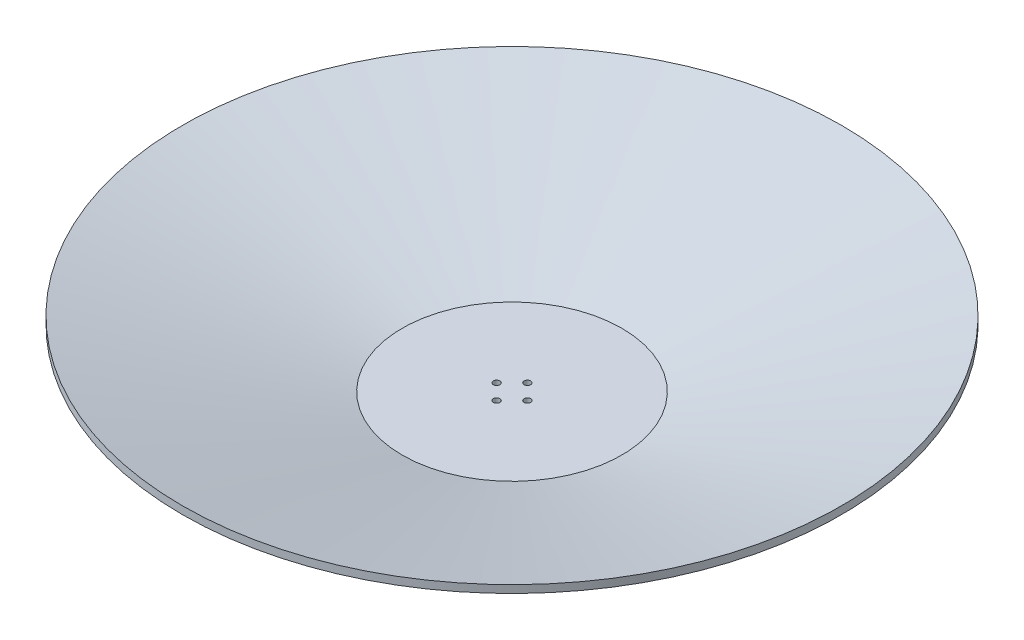
ISO-10303-21;
HEADER;
FILE_DESCRIPTION(('STEP AP214'),'2;1');
FILE_NAME('part.step','',(''),(''),'','','');
FILE_SCHEMA(('AUTOMOTIVE_DESIGN { 1 0 10303 214 1 1 1 1 }'));
ENDSEC;
DATA;
#1=APPLICATION_CONTEXT('core data for automotive mechanical design processes');
#2=APPLICATION_PROTOCOL_DEFINITION('international standard','automotive_design',2000,#1);
#3=PRODUCT_CONTEXT('',#1,'mechanical');
#4=PRODUCT('Part','Part','',(#3));
#5=PRODUCT_RELATED_PRODUCT_CATEGORY('part','',(#4));
#6=PRODUCT_DEFINITION_FORMATION('','',#4);
#7=PRODUCT_DEFINITION_CONTEXT('part definition',#1,'design');
#8=PRODUCT_DEFINITION('design','',#6,#7);
#9=PRODUCT_DEFINITION_SHAPE('','',#8);
#10=(LENGTH_UNIT() NAMED_UNIT(*) SI_UNIT(.MILLI.,.METRE.));
#11=(NAMED_UNIT(*) PLANE_ANGLE_UNIT() SI_UNIT($,.RADIAN.));
#12=(NAMED_UNIT(*) SI_UNIT($,.STERADIAN.) SOLID_ANGLE_UNIT());
#13=UNCERTAINTY_MEASURE_WITH_UNIT(LENGTH_MEASURE(1.E-05),#10,'distance_accuracy_value','');
#14=(GEOMETRIC_REPRESENTATION_CONTEXT(3) GLOBAL_UNCERTAINTY_ASSIGNED_CONTEXT((#13)) GLOBAL_UNIT_ASSIGNED_CONTEXT((#10,
#11,#12)) REPRESENTATION_CONTEXT('',''));
#15=CARTESIAN_POINT('',(0.,0.,0.));
#16=DIRECTION('',(0.,0.,1.));
#17=DIRECTION('',(1.,0.,0.));
#18=AXIS2_PLACEMENT_3D('',#15,#16,#17);
#19=CARTESIAN_POINT('',(0.,-15.,0.));
#20=DIRECTION('',(0.,-1.,0.));
#21=DIRECTION('',(0.,0.,-1.));
#22=AXIS2_PLACEMENT_3D('',#19,#20,#21);
#23=PLANE('',#22);
#24=DIRECTION('',(1.,0.,0.));
#25=VECTOR('',#24,1.);
#26=CARTESIAN_POINT('',(-29.,-15.,13.));
#27=LINE('',#26,#25);
#28=CARTESIAN_POINT('',(-29.,-15.,13.));
#29=VERTEX_POINT('',#28);
#30=CARTESIAN_POINT('',(-27.0370116691915,-15.,13.));
#31=VERTEX_POINT('',#30);
#32=EDGE_CURVE('E148',#29,#31,#27,.T.);
#33=ORIENTED_EDGE('',*,*,#32,.T.);
#34=CARTESIAN_POINT('',(0.,-15.,0.));
#35=DIRECTION('',(0.,-1.,0.));
#36=DIRECTION('',(0.,0.,-1.));
#37=AXIS2_PLACEMENT_3D('',#34,#35,#36);
#38=CIRCLE('',#37,30.);
#39=CARTESIAN_POINT('',(27.0370116691915,-15.,13.));
#40=VERTEX_POINT('',#39);
#41=EDGE_CURVE('E165',#40,#31,#38,.T.);
#42=ORIENTED_EDGE('',*,*,#41,.F.);
#43=CARTESIAN_POINT('',(29.,-15.,13.));
#44=VERTEX_POINT('',#43);
#45=EDGE_CURVE('E154',#40,#44,#27,.T.);
#46=ORIENTED_EDGE('',*,*,#45,.T.);
#47=DIRECTION('',(0.,0.,1.));
#48=VECTOR('',#47,1.);
#49=CARTESIAN_POINT('',(29.,-15.,-13.));
#50=LINE('',#49,#48);
#51=CARTESIAN_POINT('',(29.,-15.,7.68114574786857));
#52=VERTEX_POINT('',#51);
#53=EDGE_CURVE('E136',#52,#44,#50,.T.);
#54=ORIENTED_EDGE('',*,*,#53,.F.);
#55=CARTESIAN_POINT('',(29.,-15.,-7.68114574786857));
#56=VERTEX_POINT('',#55);
#57=EDGE_CURVE('E207',#56,#52,#38,.T.);
#58=ORIENTED_EDGE('',*,*,#57,.F.);
#59=CARTESIAN_POINT('',(29.,-15.,-13.));
#60=VERTEX_POINT('',#59);
#61=EDGE_CURVE('E147',#60,#56,#50,.T.);
#62=ORIENTED_EDGE('',*,*,#61,.F.);
#63=DIRECTION('',(1.,0.,0.));
#64=VECTOR('',#63,1.);
#65=CARTESIAN_POINT('',(-29.,-15.,-13.));
#66=LINE('',#65,#64);
#67=CARTESIAN_POINT('',(27.0370116691915,-15.,-13.));
#68=VERTEX_POINT('',#67);
#69=EDGE_CURVE('E174',#68,#60,#66,.T.);
#70=ORIENTED_EDGE('',*,*,#69,.F.);
#71=CARTESIAN_POINT('',(-27.0370116691915,-15.,-13.));
#72=VERTEX_POINT('',#71);
#73=EDGE_CURVE('E196',#72,#68,#38,.T.);
#74=ORIENTED_EDGE('',*,*,#73,.F.);
#75=CARTESIAN_POINT('',(-29.,-15.,-13.));
#76=VERTEX_POINT('',#75);
#77=EDGE_CURVE('E175',#76,#72,#66,.T.);
#78=ORIENTED_EDGE('',*,*,#77,.F.);
#79=DIRECTION('',(0.,0.,1.));
#80=VECTOR('',#79,1.);
#81=CARTESIAN_POINT('',(-29.,-15.,-13.));
#82=LINE('',#81,#80);
#83=CARTESIAN_POINT('',(-29.,-15.,-7.68114574786865));
#84=VERTEX_POINT('',#83);
#85=EDGE_CURVE('E159',#76,#84,#82,.T.);
#86=ORIENTED_EDGE('',*,*,#85,.T.);
#87=CARTESIAN_POINT('',(-29.,-15.,7.68114574786865));
#88=VERTEX_POINT('',#87);
#89=EDGE_CURVE('E212',#88,#84,#38,.T.);
#90=ORIENTED_EDGE('',*,*,#89,.F.);
#91=EDGE_CURVE('E178',#88,#29,#82,.T.);
#92=ORIENTED_EDGE('',*,*,#91,.T.);
#93=EDGE_LOOP('',(#33,#42,#46,#54,#58,#62,#70,#74,#78,#86,#90,#92));
#94=FACE_BOUND('',#93,.T.);
#95=CARTESIAN_POINT('',(0.,-15.,0.));
#96=DIRECTION('',(0.,-1.,0.));
#97=DIRECTION('',(0.,0.,-1.));
#98=AXIS2_PLACEMENT_3D('',#95,#96,#97);
#99=CIRCLE('',#98,35.);
#100=CARTESIAN_POINT('',(0.,-15.,-35.));
#101=VERTEX_POINT('',#100);
#102=EDGE_CURVE('E244',#101,#101,#99,.T.);
#103=ORIENTED_EDGE('',*,*,#102,.T.);
#104=EDGE_LOOP('',(#103));
#105=FACE_BOUND('',#104,.T.);
#106=ADVANCED_FACE('F45',(#94,#105),#23,.T.);
#107=CARTESIAN_POINT('',(0.,0.,0.));
#108=DIRECTION('',(0.,-1.,0.));
#109=DIRECTION('',(0.,0.,-1.));
#110=AXIS2_PLACEMENT_3D('',#107,#108,#109);
#111=CYLINDRICAL_SURFACE('',#110,30.);
#112=ORIENTED_EDGE('',*,*,#41,.T.);
#113=DIRECTION('',(0.,-1.,0.));
#114=VECTOR('',#113,1.);
#115=CARTESIAN_POINT('',(-27.0370116691915,0.,13.));
#116=LINE('',#115,#114);
#117=CARTESIAN_POINT('',(-27.0370116691915,0.,13.));
#118=VERTEX_POINT('',#117);
#119=EDGE_CURVE('E12',#31,#118,#116,.F.);
#120=ORIENTED_EDGE('',*,*,#119,.T.);
#121=CARTESIAN_POINT('',(0.,0.,0.));
#122=DIRECTION('',(0.,-1.,0.));
#123=DIRECTION('',(0.,0.,-1.));
#124=AXIS2_PLACEMENT_3D('',#121,#122,#123);
#125=CIRCLE('',#124,30.);
#126=CARTESIAN_POINT('',(27.0370116691915,0.,13.));
#127=VERTEX_POINT('',#126);
#128=EDGE_CURVE('E289',#127,#118,#125,.T.);
#129=ORIENTED_EDGE('',*,*,#128,.F.);
#130=DIRECTION('',(0.,-1.,0.));
#131=VECTOR('',#130,1.);
#132=CARTESIAN_POINT('',(27.0370116691915,0.,13.));
#133=LINE('',#132,#131);
#134=EDGE_CURVE('E53',#127,#40,#133,.T.);
#135=ORIENTED_EDGE('',*,*,#134,.T.);
#136=EDGE_LOOP('',(#112,#120,#129,#135));
#137=FACE_BOUND('',#136,.T.);
#138=ADVANCED_FACE('F287',(#137),#111,.F.);
#139=DIRECTION('',(0.,-1.,0.));
#140=VECTOR('',#139,1.);
#141=CARTESIAN_POINT('',(-27.0370116691915,0.,-13.));
#142=LINE('',#141,#140);
#143=CARTESIAN_POINT('',(-27.0370116691915,0.,-13.));
#144=VERTEX_POINT('',#143);
#145=EDGE_CURVE('E274',#72,#144,#142,.F.);
#146=ORIENTED_EDGE('',*,*,#145,.F.);
#147=ORIENTED_EDGE('',*,*,#73,.T.);
#148=DIRECTION('',(0.,-1.,0.));
#149=VECTOR('',#148,1.);
#150=CARTESIAN_POINT('',(27.0370116691915,0.,-13.));
#151=LINE('',#150,#149);
#152=CARTESIAN_POINT('',(27.0370116691915,0.,-13.));
#153=VERTEX_POINT('',#152);
#154=EDGE_CURVE('E271',#153,#68,#151,.T.);
#155=ORIENTED_EDGE('',*,*,#154,.F.);
#156=EDGE_CURVE('E203',#144,#153,#125,.T.);
#157=ORIENTED_EDGE('',*,*,#156,.F.);
#158=EDGE_LOOP('',(#146,#147,#155,#157));
#159=FACE_BOUND('',#158,.T.);
#160=ADVANCED_FACE('F313',(#159),#111,.F.);
#161=ORIENTED_EDGE('',*,*,#89,.T.);
#162=DIRECTION('',(0.,-1.,0.));
#163=VECTOR('',#162,1.);
#164=CARTESIAN_POINT('',(-29.,0.,-7.68114574786867));
#165=LINE('',#164,#163);
#166=CARTESIAN_POINT('',(-29.,0.,-7.68114574786865));
#167=VERTEX_POINT('',#166);
#168=EDGE_CURVE('E281',#84,#167,#165,.F.);
#169=ORIENTED_EDGE('',*,*,#168,.T.);
#170=CARTESIAN_POINT('',(-29.,0.,7.68114574786865));
#171=VERTEX_POINT('',#170);
#172=EDGE_CURVE('E206',#171,#167,#125,.T.);
#173=ORIENTED_EDGE('',*,*,#172,.F.);
#174=DIRECTION('',(0.,-1.,0.));
#175=VECTOR('',#174,1.);
#176=CARTESIAN_POINT('',(-29.,0.,7.68114574786867));
#177=LINE('',#176,#175);
#178=EDGE_CURVE('E277',#171,#88,#177,.T.);
#179=ORIENTED_EDGE('',*,*,#178,.T.);
#180=EDGE_LOOP('',(#161,#169,#173,#179));
#181=FACE_BOUND('',#180,.T.);
#182=ADVANCED_FACE('F299',(#181),#111,.F.);
#183=DIRECTION('',(0.,-1.,0.));
#184=VECTOR('',#183,1.);
#185=CARTESIAN_POINT('',(29.,0.,-7.68114574786859));
#186=LINE('',#185,#184);
#187=CARTESIAN_POINT('',(29.,0.,-7.68114574786857));
#188=VERTEX_POINT('',#187);
#189=EDGE_CURVE('E267',#56,#188,#186,.F.);
#190=ORIENTED_EDGE('',*,*,#189,.F.);
#191=ORIENTED_EDGE('',*,*,#57,.T.);
#192=DIRECTION('',(0.,-1.,0.));
#193=VECTOR('',#192,1.);
#194=CARTESIAN_POINT('',(29.,0.,7.68114574786859));
#195=LINE('',#194,#193);
#196=CARTESIAN_POINT('',(29.,0.,7.68114574786857));
#197=VERTEX_POINT('',#196);
#198=EDGE_CURVE('E141',#197,#52,#195,.T.);
#199=ORIENTED_EDGE('',*,*,#198,.F.);
#200=EDGE_CURVE('E208',#188,#197,#125,.T.);
#201=ORIENTED_EDGE('',*,*,#200,.F.);
#202=EDGE_LOOP('',(#190,#191,#199,#201));
#203=FACE_BOUND('',#202,.T.);
#204=ADVANCED_FACE('F326',(#203),#111,.F.);
#205=CARTESIAN_POINT('',(-7.,35.,0.));
#206=DIRECTION('',(0.,-1.,0.));
#207=DIRECTION('',(0.,0.,-1.));
#208=AXIS2_PLACEMENT_3D('',#205,#206,#207);
#209=CYLINDRICAL_SURFACE('',#208,1.5);
#210=CARTESIAN_POINT('',(-7.,5.,0.));
#211=DIRECTION('',(0.,1.,0.));
#212=DIRECTION('',(0.,0.,1.));
#213=AXIS2_PLACEMENT_3D('',#210,#211,#212);
#214=CIRCLE('',#213,1.5);
#215=CARTESIAN_POINT('',(-7.,5.,1.5));
#216=VERTEX_POINT('',#215);
#217=EDGE_CURVE('E226',#216,#216,#214,.T.);
#218=ORIENTED_EDGE('',*,*,#217,.T.);
#219=EDGE_LOOP('',(#218));
#220=FACE_BOUND('',#219,.T.);
#221=CARTESIAN_POINT('',(-7.,0.,0.));
#222=DIRECTION('',(0.,-1.,0.));
#223=DIRECTION('',(0.,0.,-1.));
#224=AXIS2_PLACEMENT_3D('',#221,#222,#223);
#225=CIRCLE('',#224,1.5);
#226=CARTESIAN_POINT('',(-7.,0.,-1.5));
#227=VERTEX_POINT('',#226);
#228=EDGE_CURVE('E222',#227,#227,#225,.F.);
#229=ORIENTED_EDGE('',*,*,#228,.F.);
#230=EDGE_LOOP('',(#229));
#231=FACE_BOUND('',#230,.T.);
#232=ADVANCED_FACE('F360',(#220,#231),#209,.F.);
#233=CARTESIAN_POINT('',(0.,35.,-7.));
#234=DIRECTION('',(0.,-1.,0.));
#235=DIRECTION('',(0.,0.,-1.));
#236=AXIS2_PLACEMENT_3D('',#233,#234,#235);
#237=CYLINDRICAL_SURFACE('',#236,1.5);
#238=CARTESIAN_POINT('',(0.,5.,-7.));
#239=DIRECTION('',(0.,1.,0.));
#240=DIRECTION('',(0.,0.,1.));
#241=AXIS2_PLACEMENT_3D('',#238,#239,#240);
#242=CIRCLE('',#241,1.5);
#243=CARTESIAN_POINT('',(0.,5.,-5.5));
#244=VERTEX_POINT('',#243);
#245=EDGE_CURVE('E251',#244,#244,#242,.T.);
#246=ORIENTED_EDGE('',*,*,#245,.T.);
#247=EDGE_LOOP('',(#246));
#248=FACE_BOUND('',#247,.T.);
#249=CARTESIAN_POINT('',(0.,0.,-7.));
#250=DIRECTION('',(0.,-1.,0.));
#251=DIRECTION('',(0.,0.,-1.));
#252=AXIS2_PLACEMENT_3D('',#249,#250,#251);
#253=CIRCLE('',#252,1.5);
#254=CARTESIAN_POINT('',(0.,0.,-8.5));
#255=VERTEX_POINT('',#254);
#256=EDGE_CURVE('E217',#255,#255,#253,.F.);
#257=ORIENTED_EDGE('',*,*,#256,.F.);
#258=EDGE_LOOP('',(#257));
#259=FACE_BOUND('',#258,.T.);
#260=ADVANCED_FACE('F365',(#248,#259),#237,.F.);
#261=CARTESIAN_POINT('',(7.,35.,0.));
#262=DIRECTION('',(0.,-1.,0.));
#263=DIRECTION('',(0.,0.,-1.));
#264=AXIS2_PLACEMENT_3D('',#261,#262,#263);
#265=CYLINDRICAL_SURFACE('',#264,1.5);
#266=CARTESIAN_POINT('',(7.,5.,0.));
#267=DIRECTION('',(0.,1.,0.));
#268=DIRECTION('',(0.,0.,1.));
#269=AXIS2_PLACEMENT_3D('',#266,#267,#268);
#270=CIRCLE('',#269,1.5);
#271=CARTESIAN_POINT('',(7.,5.,1.5));
#272=VERTEX_POINT('',#271);
#273=EDGE_CURVE('E255',#272,#272,#270,.T.);
#274=ORIENTED_EDGE('',*,*,#273,.T.);
#275=EDGE_LOOP('',(#274));
#276=FACE_BOUND('',#275,.T.);
#277=CARTESIAN_POINT('',(7.,0.,0.));
#278=DIRECTION('',(0.,-1.,0.));
#279=DIRECTION('',(0.,0.,-1.));
#280=AXIS2_PLACEMENT_3D('',#277,#278,#279);
#281=CIRCLE('',#280,1.5);
#282=CARTESIAN_POINT('',(7.,0.,-1.5));
#283=VERTEX_POINT('',#282);
#284=EDGE_CURVE('E213',#283,#283,#281,.F.);
#285=ORIENTED_EDGE('',*,*,#284,.F.);
#286=EDGE_LOOP('',(#285));
#287=FACE_BOUND('',#286,.T.);
#288=ADVANCED_FACE('F399',(#276,#287),#265,.F.);
#289=CARTESIAN_POINT('',(0.,35.,7.));
#290=DIRECTION('',(0.,-1.,0.));
#291=DIRECTION('',(0.,0.,-1.));
#292=AXIS2_PLACEMENT_3D('',#289,#290,#291);
#293=CYLINDRICAL_SURFACE('',#292,1.5);
#294=CARTESIAN_POINT('',(0.,5.,7.));
#295=DIRECTION('',(0.,1.,0.));
#296=DIRECTION('',(0.,0.,1.));
#297=AXIS2_PLACEMENT_3D('',#294,#295,#296);
#298=CIRCLE('',#297,1.5);
#299=CARTESIAN_POINT('',(0.,5.,8.5));
#300=VERTEX_POINT('',#299);
#301=EDGE_CURVE('E232',#300,#300,#298,.T.);
#302=ORIENTED_EDGE('',*,*,#301,.T.);
#303=EDGE_LOOP('',(#302));
#304=FACE_BOUND('',#303,.T.);
#305=CARTESIAN_POINT('',(0.,0.,7.));
#306=DIRECTION('',(0.,-1.,0.));
#307=DIRECTION('',(0.,0.,-1.));
#308=AXIS2_PLACEMENT_3D('',#305,#306,#307);
#309=CIRCLE('',#308,1.5);
#310=CARTESIAN_POINT('',(0.,0.,5.5));
#311=VERTEX_POINT('',#310);
#312=EDGE_CURVE('E218',#311,#311,#309,.F.);
#313=ORIENTED_EDGE('',*,*,#312,.F.);
#314=EDGE_LOOP('',(#313));
#315=FACE_BOUND('',#314,.T.);
#316=ADVANCED_FACE('F408',(#304,#315),#293,.F.);
#317=CARTESIAN_POINT('',(0.,-15.,0.));
#318=DIRECTION('',(0.,1.,0.));
#319=DIRECTION('',(0.,0.,1.));
#320=AXIS2_PLACEMENT_3D('',#317,#318,#319);
#321=CONICAL_SURFACE('',#320,35.,0.714690107750987);
#322=CARTESIAN_POINT('',(0.,-5.51060153301255,0.));
#323=DIRECTION('',(0.,-1.,0.));
#324=DIRECTION('',(0.,0.,-1.));
#325=AXIS2_PLACEMENT_3D('',#322,#323,#324);
#326=CIRCLE('',#325,43.2341108925556);
#327=CARTESIAN_POINT('',(0.,-5.51060153301255,43.2341108925556));
#328=VERTEX_POINT('',#327);
#329=EDGE_CURVE('E240',#328,#328,#326,.T.);
#330=ORIENTED_EDGE('',*,*,#329,.T.);
#331=EDGE_LOOP('',(#330));
#332=FACE_BOUND('',#331,.T.);
#333=ORIENTED_EDGE('',*,*,#102,.F.);
#334=EDGE_LOOP('',(#333));
#335=FACE_BOUND('',#334,.T.);
#336=ADVANCED_FACE('F417',(#332,#335),#321,.T.);
#337=CARTESIAN_POINT('',(0.,-5.51060153301255,0.));
#338=DIRECTION('',(0.,1.,0.));
#339=DIRECTION('',(0.,0.,1.));
#340=AXIS2_PLACEMENT_3D('',#337,#338,#339);
#341=CONICAL_SURFACE('',#340,43.2341108925556,1.23710730583554);
#342=CARTESIAN_POINT('',(0.,31.5,0.));
#343=DIRECTION('',(0.,-1.,0.));
#344=DIRECTION('',(0.,0.,-1.));
#345=AXIS2_PLACEMENT_3D('',#342,#343,#344);
#346=CIRCLE('',#345,150.);
#347=CARTESIAN_POINT('',(0.,31.5,150.));
#348=VERTEX_POINT('',#347);
#349=EDGE_CURVE('E236',#348,#348,#346,.T.);
#350=CARTESIAN_POINT('',(0.,31.5,150.));
#351=CARTESIAN_POINT('',(0.,31.1144729006978,148.887855321797));
#352=CARTESIAN_POINT('',(0.,30.7289458013956,147.775710643595));
#353=CARTESIAN_POINT('',(0.,29.9578916027912,145.55142128719));
#354=CARTESIAN_POINT('',(0.,29.5723645034889,144.439276608987));
#355=CARTESIAN_POINT('',(0.,28.8013103048845,142.214987252582));
#356=CARTESIAN_POINT('',(0.,28.4157832055823,141.10284257438));
#357=CARTESIAN_POINT('',(0.,27.6447290069779,138.878553217975));
#358=CARTESIAN_POINT('',(0.,27.2592019076756,137.766408539772));
#359=CARTESIAN_POINT('',(0.,26.4881477090712,135.542119183367));
#360=CARTESIAN_POINT('',(0.,26.102620609769,134.429974505164));
#361=CARTESIAN_POINT('',(0.,25.3315664111646,132.205685148759));
#362=CARTESIAN_POINT('',(0.,24.9460393118624,131.093540470557));
#363=CARTESIAN_POINT('',(0.,24.1749851132579,128.869251114152));
#364=CARTESIAN_POINT('',(0.,23.7894580139557,127.757106435949));
#365=CARTESIAN_POINT('',(0.,23.0184038153513,125.532817079544));
#366=CARTESIAN_POINT('',(0.,22.6328767160491,124.420672401341));
#367=CARTESIAN_POINT('',(0.,21.8618225174447,122.196383044936));
#368=CARTESIAN_POINT('',(0.,21.4762954181424,121.084238366734));
#369=CARTESIAN_POINT('',(0.,20.705241219538,118.859949010329));
#370=CARTESIAN_POINT('',(0.,20.3197141202358,117.747804332126));
#371=CARTESIAN_POINT('',(0.,19.5486599216314,115.523514975721));
#372=CARTESIAN_POINT('',(0.,19.1631328223291,114.411370297519));
#373=CARTESIAN_POINT('',(0.,18.3920786237247,112.187080941113));
#374=CARTESIAN_POINT('',(0.,18.0065515244225,111.074936262911));
#375=CARTESIAN_POINT('',(0.,17.2354973258181,108.850646906506));
#376=CARTESIAN_POINT('',(0.,16.8499702265159,107.738502228303));
#377=CARTESIAN_POINT('',(0.,16.0789160279114,105.514212871898));
#378=CARTESIAN_POINT('',(0.,15.6933889286092,104.402068193696));
#379=CARTESIAN_POINT('',(0.,14.9223347300048,102.177778837291));
#380=CARTESIAN_POINT('',(0.,14.5368076307026,101.065634159088));
#381=CARTESIAN_POINT('',(0.,13.7657534320982,98.8413448026829));
#382=CARTESIAN_POINT('',(0.,13.3802263327959,97.7292001244804));
#383=CARTESIAN_POINT('',(0.,12.6091721341915,95.5049107680753));
#384=CARTESIAN_POINT('',(0.,12.2236450348893,94.3927660898728));
#385=CARTESIAN_POINT('',(0.,11.4525908362849,92.1684767334677));
#386=CARTESIAN_POINT('',(0.,11.0670637369827,91.0563320552651));
#387=CARTESIAN_POINT('',(0.,10.2960095383782,88.83204269886));
#388=CARTESIAN_POINT('',(0.,9.91048243907601,87.7198980206575));
#389=CARTESIAN_POINT('',(0.,9.13942824047158,85.4956086642524));
#390=CARTESIAN_POINT('',(0.,8.75390114116937,84.3834639860498));
#391=CARTESIAN_POINT('',(0.,7.98284694256494,82.1591746296447));
#392=CARTESIAN_POINT('',(0.,7.59731984326273,81.0470299514422));
#393=CARTESIAN_POINT('',(0.,6.8262656446583,78.8227405950371));
#394=CARTESIAN_POINT('',(0.,6.44073854535609,77.7105959168346));
#395=CARTESIAN_POINT('',(0.,5.66968434675166,75.4863065604295));
#396=CARTESIAN_POINT('',(0.,5.28415724744944,74.3741618822269));
#397=CARTESIAN_POINT('',(0.,4.51310304884502,72.1498725258218));
#398=CARTESIAN_POINT('',(0.,4.1275759495428,71.0377278476193));
#399=CARTESIAN_POINT('',(0.,3.35652175093837,68.8134384912142));
#400=CARTESIAN_POINT('',(0.,2.97099465163616,67.7012938130117));
#401=CARTESIAN_POINT('',(0.,2.19994045303173,65.4770044566066));
#402=CARTESIAN_POINT('',(0.,1.81441335372952,64.364859778404));
#403=CARTESIAN_POINT('',(0.,1.04335915512509,62.1405704219989));
#404=CARTESIAN_POINT('',(0.,0.657832055822873,61.0284257437964));
#405=CARTESIAN_POINT('',(0.,-0.113222142781554,58.8041363873913));
#406=CARTESIAN_POINT('',(0.,-0.498749242083768,57.6919917091887));
#407=CARTESIAN_POINT('',(0.,-1.2698034406882,55.4677023527836));
#408=CARTESIAN_POINT('',(0.,-1.65533053999041,54.3555576745811));
#409=CARTESIAN_POINT('',(0.,-2.42638473859484,52.131268318176));
#410=CARTESIAN_POINT('',(0.,-2.81191183789705,51.0191236399735));
#411=CARTESIAN_POINT('',(0.,-3.58296603650148,48.7948342835684));
#412=CARTESIAN_POINT('',(0.,-3.9684931358037,47.6826896053658));
#413=CARTESIAN_POINT('',(0.,-4.73954733440812,45.4584002489607));
#414=CARTESIAN_POINT('',(0.,-5.12507443371034,44.3462555707582));
#415=CARTESIAN_POINT('',(0.,-5.51060153301255,43.2341108925556));
#416=B_SPLINE_CURVE_WITH_KNOTS('',3,(#350,#351,#352,#353,#354,#355,#356,#357,#358,#359,#360,
#361,#362,#363,#364,#365,#366,#367,#368,#369,#370,#371,#372,#373,#374,#375,#376,#377,#378,#379,
#380,#381,#382,#383,#384,#385,#386,#387,#388,#389,#390,#391,#392,#393,#394,#395,#396,#397,#398,
#399,#400,#401,#402,#403,#404,#405,#406,#407,#408,#409,#410,#411,#412,#413,#414,#415),
.UNSPECIFIED.,.F.,.F.,(4,2,2,2,2,2,2,2,2,2,2,2,2,2,2,2,2,2,2,2,2,2,2,2,2,2,2,2,2,2,2,2,4),(0.,
3.53121400738552,7.06242801477101,10.5936420221565,14.124856029542,17.6560700369275,
21.1872840443131,24.7184980516986,28.2497120590841,31.7809260664696,35.3121400738551,
38.8433540812406,42.3745680886261,45.9057820960116,49.4369961033971,52.9682101107826,
56.4994241181681,60.0306381255536,63.5618521329391,67.0930661403247,70.6242801477101,
74.1554941550956,77.6867081624811,81.2179221698666,84.7491361772521,88.2803501846376,
91.8115641920231,95.3427781994086,98.8739922067941,102.40520621418,105.936420221565,
109.467634228951,112.998848236336),.UNSPECIFIED.);
#417=EDGE_CURVE('BSEAM444',#348,#328,#416,.T.);
#418=ORIENTED_EDGE('',*,*,#349,.T.);
#419=ORIENTED_EDGE('',*,*,#329,.F.);
#420=ORIENTED_EDGE('',*,*,#417,.T.);
#421=ORIENTED_EDGE('',*,*,#417,.F.);
#422=EDGE_LOOP('',(#418,#420,#419,#421));
#423=FACE_BOUND('',#422,.T.);
#424=ADVANCED_FACE('F444',(#423),#341,.T.);
#425=CARTESIAN_POINT('',(0.,-7.77338508516067,0.));
#426=DIRECTION('',(0.,-1.,0.));
#427=DIRECTION('',(0.,0.,-1.));
#428=AXIS2_PLACEMENT_3D('',#425,#426,#427);
#429=CYLINDRICAL_SURFACE('',#428,150.);
#430=CARTESIAN_POINT('',(0.,35.,0.));
#431=DIRECTION('',(0.,-1.,0.));
#432=DIRECTION('',(0.,0.,-1.));
#433=AXIS2_PLACEMENT_3D('',#430,#431,#432);
#434=CIRCLE('',#433,150.);
#435=CARTESIAN_POINT('',(0.,35.,150.));
#436=VERTEX_POINT('',#435);
#437=EDGE_CURVE('E231',#436,#436,#434,.T.);
#438=ORIENTED_EDGE('',*,*,#437,.T.);
#439=EDGE_LOOP('',(#438));
#440=FACE_BOUND('',#439,.T.);
#441=ORIENTED_EDGE('',*,*,#349,.F.);
#442=EDGE_LOOP('',(#441));
#443=FACE_BOUND('',#442,.T.);
#444=ADVANCED_FACE('F434',(#440,#443),#429,.T.);
#445=CARTESIAN_POINT('',(0.,35.,0.));
#446=DIRECTION('',(0.,1.,0.));
#447=DIRECTION('',(0.,0.,1.));
#448=AXIS2_PLACEMENT_3D('',#445,#446,#447);
#449=CONICAL_SURFACE('',#448,150.,1.27933953231703);
#450=CARTESIAN_POINT('',(0.,5.,0.));
#451=DIRECTION('',(0.,-1.,0.));
#452=DIRECTION('',(0.,0.,-1.));
#453=AXIS2_PLACEMENT_3D('',#450,#451,#452);
#454=CIRCLE('',#453,50.);
#455=CARTESIAN_POINT('',(0.,5.,50.));
#456=VERTEX_POINT('',#455);
#457=EDGE_CURVE('E227',#456,#456,#454,.T.);
#458=CARTESIAN_POINT('',(0.,5.,50.));
#459=CARTESIAN_POINT('',(0.,5.3125,51.0416666666666));
#460=CARTESIAN_POINT('',(0.,5.62500000000001,52.0833333333333));
#461=CARTESIAN_POINT('',(0.,6.25000000000001,54.1666666666667));
#462=CARTESIAN_POINT('',(0.,6.56250000000001,55.2083333333333));
#463=CARTESIAN_POINT('',(0.,7.18750000000001,57.2916666666667));
#464=CARTESIAN_POINT('',(0.,7.5,58.3333333333333));
#465=CARTESIAN_POINT('',(0.,8.125,60.4166666666667));
#466=CARTESIAN_POINT('',(0.,8.4375,61.4583333333333));
#467=CARTESIAN_POINT('',(0.,9.06250000000001,63.5416666666667));
#468=CARTESIAN_POINT('',(0.,9.37500000000001,64.5833333333333));
#469=CARTESIAN_POINT('',(0.,10.,66.6666666666667));
#470=CARTESIAN_POINT('',(0.,10.3125,67.7083333333333));
#471=CARTESIAN_POINT('',(0.,10.9375,69.7916666666667));
#472=CARTESIAN_POINT('',(0.,11.25,70.8333333333333));
#473=CARTESIAN_POINT('',(0.,11.875,72.9166666666666));
#474=CARTESIAN_POINT('',(0.,12.1875,73.9583333333333));
#475=CARTESIAN_POINT('',(0.,12.8125,76.0416666666666));
#476=CARTESIAN_POINT('',(0.,13.125,77.0833333333333));
#477=CARTESIAN_POINT('',(0.,13.75,79.1666666666666));
#478=CARTESIAN_POINT('',(0.,14.0625,80.2083333333333));
#479=CARTESIAN_POINT('',(0.,14.6875,82.2916666666667));
#480=CARTESIAN_POINT('',(0.,15.,83.3333333333333));
#481=CARTESIAN_POINT('',(0.,15.625,85.4166666666667));
#482=CARTESIAN_POINT('',(0.,15.9375,86.4583333333333));
#483=CARTESIAN_POINT('',(0.,16.5625,88.5416666666667));
#484=CARTESIAN_POINT('',(0.,16.875,89.5833333333333));
#485=CARTESIAN_POINT('',(0.,17.5,91.6666666666667));
#486=CARTESIAN_POINT('',(0.,17.8125,92.7083333333333));
#487=CARTESIAN_POINT('',(0.,18.4375,94.7916666666667));
#488=CARTESIAN_POINT('',(0.,18.75,95.8333333333333));
#489=CARTESIAN_POINT('',(0.,19.375,97.9166666666667));
#490=CARTESIAN_POINT('',(0.,19.6875,98.9583333333333));
#491=CARTESIAN_POINT('',(0.,20.3125,101.041666666667));
#492=CARTESIAN_POINT('',(0.,20.625,102.083333333333));
#493=CARTESIAN_POINT('',(0.,21.25,104.166666666667));
#494=CARTESIAN_POINT('',(0.,21.5625,105.208333333333));
#495=CARTESIAN_POINT('',(0.,22.1875,107.291666666667));
#496=CARTESIAN_POINT('',(0.,22.5,108.333333333333));
#497=CARTESIAN_POINT('',(0.,23.125,110.416666666667));
#498=CARTESIAN_POINT('',(0.,23.4375,111.458333333333));
#499=CARTESIAN_POINT('',(0.,24.0625,113.541666666667));
#500=CARTESIAN_POINT('',(0.,24.375,114.583333333333));
#501=CARTESIAN_POINT('',(0.,25.,116.666666666667));
#502=CARTESIAN_POINT('',(0.,25.3125,117.708333333333));
#503=CARTESIAN_POINT('',(0.,25.9375,119.791666666667));
#504=CARTESIAN_POINT('',(0.,26.25,120.833333333333));
#505=CARTESIAN_POINT('',(0.,26.875,122.916666666667));
#506=CARTESIAN_POINT('',(0.,27.1875,123.958333333333));
#507=CARTESIAN_POINT('',(0.,27.8125,126.041666666667));
#508=CARTESIAN_POINT('',(0.,28.125,127.083333333333));
#509=CARTESIAN_POINT('',(0.,28.75,129.166666666667));
#510=CARTESIAN_POINT('',(0.,29.0625,130.208333333333));
#511=CARTESIAN_POINT('',(0.,29.6875,132.291666666667));
#512=CARTESIAN_POINT('',(0.,30.,133.333333333333));
#513=CARTESIAN_POINT('',(0.,30.625,135.416666666667));
#514=CARTESIAN_POINT('',(0.,30.9375,136.458333333333));
#515=CARTESIAN_POINT('',(0.,31.5625,138.541666666667));
#516=CARTESIAN_POINT('',(0.,31.875,139.583333333333));
#517=CARTESIAN_POINT('',(0.,32.5,141.666666666667));
#518=CARTESIAN_POINT('',(0.,32.8125,142.708333333333));
#519=CARTESIAN_POINT('',(0.,33.4375,144.791666666667));
#520=CARTESIAN_POINT('',(0.,33.75,145.833333333333));
#521=CARTESIAN_POINT('',(0.,34.375,147.916666666667));
#522=CARTESIAN_POINT('',(0.,34.6875,148.958333333333));
#523=CARTESIAN_POINT('',(0.,35.,150.));
#524=B_SPLINE_CURVE_WITH_KNOTS('',3,(#458,#459,#460,#461,#462,#463,#464,#465,#466,#467,#468,
#469,#470,#471,#472,#473,#474,#475,#476,#477,#478,#479,#480,#481,#482,#483,#484,#485,#486,#487,
#488,#489,#490,#491,#492,#493,#494,#495,#496,#497,#498,#499,#500,#501,#502,#503,#504,#505,#506,
#507,#508,#509,#510,#511,#512,#513,#514,#515,#516,#517,#518,#519,#520,#521,#522,#523),
.UNSPECIFIED.,.F.,.F.,(4,2,2,2,2,2,2,2,2,2,2,2,2,2,2,2,2,2,2,2,2,2,2,2,2,2,2,2,2,2,2,2,4),(0.,
3.26259578403455,6.5251915680691,9.78778735210365,13.0503831361382,16.3129789201727,
19.5755747042073,22.8381704882418,26.1007662722764,29.3633620563109,32.6259578403455,
35.88855362438,39.1511494084146,42.4137451924491,45.6763409764837,48.9389367605182,
52.2015325445528,55.4641283285873,58.7267241126219,61.9893198966564,65.251915680691,
68.5145114647255,71.7771072487601,75.0397030327946,78.3022988168292,81.5648946008638,
84.8274903848983,88.0900861689328,91.3526819529674,94.6152777370019,97.8778735210365,
101.140469305071,104.403065089106),.UNSPECIFIED.);
#525=EDGE_CURVE('BSEAM424',#456,#436,#524,.T.);
#526=ORIENTED_EDGE('',*,*,#457,.T.);
#527=ORIENTED_EDGE('',*,*,#437,.F.);
#528=ORIENTED_EDGE('',*,*,#525,.T.);
#529=ORIENTED_EDGE('',*,*,#525,.F.);
#530=EDGE_LOOP('',(#526,#528,#527,#529));
#531=FACE_BOUND('',#530,.T.);
#532=ADVANCED_FACE('F424',(#531),#449,.F.);
#533=CARTESIAN_POINT('',(0.,5.,0.));
#534=DIRECTION('',(0.,1.,0.));
#535=DIRECTION('',(0.,0.,1.));
#536=AXIS2_PLACEMENT_3D('',#533,#534,#535);
#537=PLANE('',#536);
#538=ORIENTED_EDGE('',*,*,#301,.F.);
#539=EDGE_LOOP('',(#538));
#540=FACE_BOUND('',#539,.T.);
#541=ORIENTED_EDGE('',*,*,#273,.F.);
#542=EDGE_LOOP('',(#541));
#543=FACE_BOUND('',#542,.T.);
#544=ORIENTED_EDGE('',*,*,#245,.F.);
#545=EDGE_LOOP('',(#544));
#546=FACE_BOUND('',#545,.T.);
#547=ORIENTED_EDGE('',*,*,#217,.F.);
#548=EDGE_LOOP('',(#547));
#549=FACE_BOUND('',#548,.T.);
#550=ORIENTED_EDGE('',*,*,#457,.F.);
#551=EDGE_LOOP('',(#550));
#552=FACE_BOUND('',#551,.T.);
#553=ADVANCED_FACE('F389',(#540,#543,#546,#549,#552),#537,.T.);
#554=CARTESIAN_POINT('',(0.,0.,0.));
#555=DIRECTION('',(0.,-1.,0.));
#556=DIRECTION('',(0.,0.,-1.));
#557=AXIS2_PLACEMENT_3D('',#554,#555,#556);
#558=PLANE('',#557);
#559=ORIENTED_EDGE('',*,*,#172,.T.);
#560=DIRECTION('',(0.,0.,1.));
#561=VECTOR('',#560,1.);
#562=CARTESIAN_POINT('',(-29.,0.,-13.));
#563=LINE('',#562,#561);
#564=CARTESIAN_POINT('',(-29.,0.,-13.));
#565=VERTEX_POINT('',#564);
#566=EDGE_CURVE('E167',#565,#167,#563,.T.);
#567=ORIENTED_EDGE('',*,*,#566,.F.);
#568=DIRECTION('',(1.,0.,0.));
#569=VECTOR('',#568,1.);
#570=CARTESIAN_POINT('',(-29.,0.,-13.));
#571=LINE('',#570,#569);
#572=EDGE_CURVE('E60',#565,#144,#571,.T.);
#573=ORIENTED_EDGE('',*,*,#572,.T.);
#574=ORIENTED_EDGE('',*,*,#156,.T.);
#575=CARTESIAN_POINT('',(29.,0.,-13.));
#576=VERTEX_POINT('',#575);
#577=EDGE_CURVE('E189',#153,#576,#571,.T.);
#578=ORIENTED_EDGE('',*,*,#577,.T.);
#579=DIRECTION('',(0.,0.,1.));
#580=VECTOR('',#579,1.);
#581=CARTESIAN_POINT('',(29.,0.,-13.));
#582=LINE('',#581,#580);
#583=EDGE_CURVE('E186',#576,#188,#582,.T.);
#584=ORIENTED_EDGE('',*,*,#583,.T.);
#585=ORIENTED_EDGE('',*,*,#200,.T.);
#586=CARTESIAN_POINT('',(29.,0.,13.));
#587=VERTEX_POINT('',#586);
#588=EDGE_CURVE('E185',#197,#587,#582,.T.);
#589=ORIENTED_EDGE('',*,*,#588,.T.);
#590=DIRECTION('',(1.,0.,0.));
#591=VECTOR('',#590,1.);
#592=CARTESIAN_POINT('',(-29.,0.,13.));
#593=LINE('',#592,#591);
#594=EDGE_CURVE('E156',#127,#587,#593,.T.);
#595=ORIENTED_EDGE('',*,*,#594,.F.);
#596=ORIENTED_EDGE('',*,*,#128,.T.);
#597=CARTESIAN_POINT('',(-29.,0.,13.));
#598=VERTEX_POINT('',#597);
#599=EDGE_CURVE('E182',#598,#118,#593,.T.);
#600=ORIENTED_EDGE('',*,*,#599,.F.);
#601=EDGE_CURVE('E67',#171,#598,#563,.T.);
#602=ORIENTED_EDGE('',*,*,#601,.F.);
#603=EDGE_LOOP('',(#559,#567,#573,#574,#578,#584,#585,#589,#595,#596,#600,#602));
#604=FACE_BOUND('',#603,.T.);
#605=ORIENTED_EDGE('',*,*,#312,.T.);
#606=EDGE_LOOP('',(#605));
#607=FACE_BOUND('',#606,.T.);
#608=ORIENTED_EDGE('',*,*,#284,.T.);
#609=EDGE_LOOP('',(#608));
#610=FACE_BOUND('',#609,.T.);
#611=ORIENTED_EDGE('',*,*,#256,.T.);
#612=EDGE_LOOP('',(#611));
#613=FACE_BOUND('',#612,.T.);
#614=ORIENTED_EDGE('',*,*,#228,.T.);
#615=EDGE_LOOP('',(#614));
#616=FACE_BOUND('',#615,.T.);
#617=ADVANCED_FACE('F295',(#604,#607,#610,#613,#616),#558,.T.);
#618=CARTESIAN_POINT('',(29.,-15.,-13.));
#619=DIRECTION('',(-1.,0.,0.));
#620=DIRECTION('',(0.,0.,1.));
#621=AXIS2_PLACEMENT_3D('',#618,#619,#620);
#622=PLANE('',#621);
#623=ORIENTED_EDGE('',*,*,#189,.T.);
#624=ORIENTED_EDGE('',*,*,#583,.F.);
#625=DIRECTION('',(0.,1.,0.));
#626=VECTOR('',#625,1.);
#627=CARTESIAN_POINT('',(29.,-15.,-13.));
#628=LINE('',#627,#626);
#629=EDGE_CURVE('E158',#60,#576,#628,.T.);
#630=ORIENTED_EDGE('',*,*,#629,.F.);
#631=ORIENTED_EDGE('',*,*,#61,.T.);
#632=EDGE_LOOP('',(#623,#624,#630,#631));
#633=FACE_BOUND('',#632,.T.);
#634=ADVANCED_FACE('F322',(#633),#622,.T.);
#635=CARTESIAN_POINT('',(-29.,-15.,-13.));
#636=DIRECTION('',(0.,0.,1.));
#637=DIRECTION('',(1.,0.,0.));
#638=AXIS2_PLACEMENT_3D('',#635,#636,#637);
#639=PLANE('',#638);
#640=ORIENTED_EDGE('',*,*,#154,.T.);
#641=ORIENTED_EDGE('',*,*,#69,.T.);
#642=ORIENTED_EDGE('',*,*,#629,.T.);
#643=ORIENTED_EDGE('',*,*,#577,.F.);
#644=EDGE_LOOP('',(#640,#641,#642,#643));
#645=FACE_BOUND('',#644,.T.);
#646=ADVANCED_FACE('F319',(#645),#639,.T.);
#647=ORIENTED_EDGE('',*,*,#198,.T.);
#648=ORIENTED_EDGE('',*,*,#53,.T.);
#649=DIRECTION('',(0.,1.,0.));
#650=VECTOR('',#649,1.);
#651=CARTESIAN_POINT('',(29.,-15.,13.));
#652=LINE('',#651,#650);
#653=EDGE_CURVE('E139',#44,#587,#652,.T.);
#654=ORIENTED_EDGE('',*,*,#653,.T.);
#655=ORIENTED_EDGE('',*,*,#588,.F.);
#656=EDGE_LOOP('',(#647,#648,#654,#655));
#657=FACE_BOUND('',#656,.T.);
#658=ADVANCED_FACE('F138',(#657),#622,.T.);
#659=CARTESIAN_POINT('',(-29.,-15.,13.));
#660=DIRECTION('',(0.,0.,1.));
#661=DIRECTION('',(1.,0.,0.));
#662=AXIS2_PLACEMENT_3D('',#659,#660,#661);
#663=PLANE('',#662);
#664=ORIENTED_EDGE('',*,*,#594,.T.);
#665=ORIENTED_EDGE('',*,*,#653,.F.);
#666=ORIENTED_EDGE('',*,*,#45,.F.);
#667=ORIENTED_EDGE('',*,*,#134,.F.);
#668=EDGE_LOOP('',(#664,#665,#666,#667));
#669=FACE_BOUND('',#668,.T.);
#670=ADVANCED_FACE('F152',(#669),#663,.F.);
#671=CARTESIAN_POINT('',(-29.,-15.,-13.));
#672=DIRECTION('',(-1.,0.,0.));
#673=DIRECTION('',(0.,0.,1.));
#674=AXIS2_PLACEMENT_3D('',#671,#672,#673);
#675=PLANE('',#674);
#676=ORIENTED_EDGE('',*,*,#601,.T.);
#677=DIRECTION('',(0.,1.,0.));
#678=VECTOR('',#677,1.);
#679=CARTESIAN_POINT('',(-29.,-15.,13.));
#680=LINE('',#679,#678);
#681=EDGE_CURVE('E192',#29,#598,#680,.T.);
#682=ORIENTED_EDGE('',*,*,#681,.F.);
#683=ORIENTED_EDGE('',*,*,#91,.F.);
#684=ORIENTED_EDGE('',*,*,#178,.F.);
#685=EDGE_LOOP('',(#676,#682,#683,#684));
#686=FACE_BOUND('',#685,.T.);
#687=ADVANCED_FACE('F331',(#686),#675,.F.);
#688=ORIENTED_EDGE('',*,*,#32,.F.);
#689=ORIENTED_EDGE('',*,*,#681,.T.);
#690=ORIENTED_EDGE('',*,*,#599,.T.);
#691=ORIENTED_EDGE('',*,*,#119,.F.);
#692=EDGE_LOOP('',(#688,#689,#690,#691));
#693=FACE_BOUND('',#692,.T.);
#694=ADVANCED_FACE('F334',(#693),#663,.F.);
#695=ORIENTED_EDGE('',*,*,#85,.F.);
#696=DIRECTION('',(0.,1.,0.));
#697=VECTOR('',#696,1.);
#698=CARTESIAN_POINT('',(-29.,-15.,-13.));
#699=LINE('',#698,#697);
#700=EDGE_CURVE('E197',#76,#565,#699,.T.);
#701=ORIENTED_EDGE('',*,*,#700,.T.);
#702=ORIENTED_EDGE('',*,*,#566,.T.);
#703=ORIENTED_EDGE('',*,*,#168,.F.);
#704=EDGE_LOOP('',(#695,#701,#702,#703));
#705=FACE_BOUND('',#704,.T.);
#706=ADVANCED_FACE('F303',(#705),#675,.F.);
#707=ORIENTED_EDGE('',*,*,#145,.T.);
#708=ORIENTED_EDGE('',*,*,#572,.F.);
#709=ORIENTED_EDGE('',*,*,#700,.F.);
#710=ORIENTED_EDGE('',*,*,#77,.T.);
#711=EDGE_LOOP('',(#707,#708,#709,#710));
#712=FACE_BOUND('',#711,.T.);
#713=ADVANCED_FACE('F310',(#712),#639,.T.);
#714=CLOSED_SHELL('',(#106,#138,#160,#182,#204,#232,#260,#288,#316,#336,#424,#444,#532,#553,
#617,#634,#646,#658,#670,#687,#694,#706,#713));
#715=MANIFOLD_SOLID_BREP('B2',#714);
#716=ADVANCED_BREP_SHAPE_REPRESENTATION('',(#18,#715),#14);
#717=SHAPE_DEFINITION_REPRESENTATION(#9,#716);
ENDSEC;
END-ISO-10303-21;
